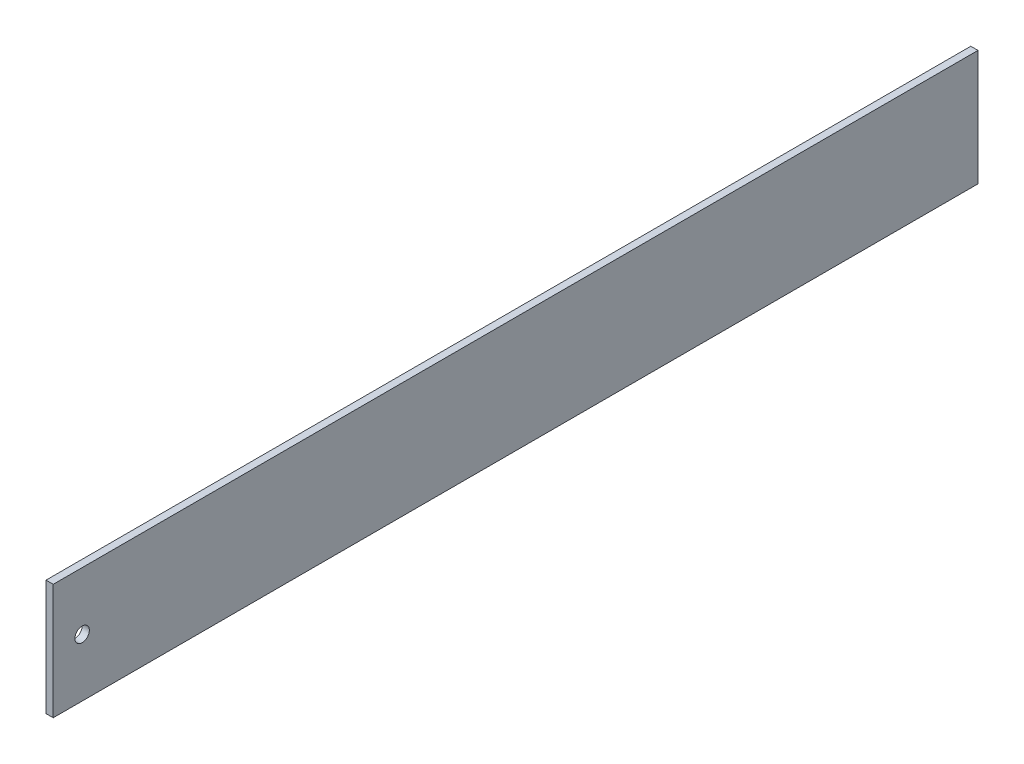
ISO-10303-21;
HEADER;
FILE_DESCRIPTION(('STEP AP214'),'2;1');
FILE_NAME('part.step','',(''),(''),'','','');
FILE_SCHEMA(('AUTOMOTIVE_DESIGN { 1 0 10303 214 1 1 1 1 }'));
ENDSEC;
DATA;
#1=APPLICATION_CONTEXT('core data for automotive mechanical design processes');
#2=APPLICATION_PROTOCOL_DEFINITION('international standard','automotive_design',2000,#1);
#3=PRODUCT_CONTEXT('',#1,'mechanical');
#4=PRODUCT('Part','Part','',(#3));
#5=PRODUCT_RELATED_PRODUCT_CATEGORY('part','',(#4));
#6=PRODUCT_DEFINITION_FORMATION('','',#4);
#7=PRODUCT_DEFINITION_CONTEXT('part definition',#1,'design');
#8=PRODUCT_DEFINITION('design','',#6,#7);
#9=PRODUCT_DEFINITION_SHAPE('','',#8);
#10=(LENGTH_UNIT() NAMED_UNIT(*) SI_UNIT(.MILLI.,.METRE.));
#11=(NAMED_UNIT(*) PLANE_ANGLE_UNIT() SI_UNIT($,.RADIAN.));
#12=(NAMED_UNIT(*) SI_UNIT($,.STERADIAN.) SOLID_ANGLE_UNIT());
#13=UNCERTAINTY_MEASURE_WITH_UNIT(LENGTH_MEASURE(1.E-05),#10,'distance_accuracy_value','');
#14=(GEOMETRIC_REPRESENTATION_CONTEXT(3) GLOBAL_UNCERTAINTY_ASSIGNED_CONTEXT((#13)) GLOBAL_UNIT_ASSIGNED_CONTEXT((#10,
#11,#12)) REPRESENTATION_CONTEXT('',''));
#15=CARTESIAN_POINT('',(0.,0.,0.));
#16=DIRECTION('',(0.,0.,1.));
#17=DIRECTION('',(1.,0.,0.));
#18=AXIS2_PLACEMENT_3D('',#15,#16,#17);
#19=CARTESIAN_POINT('',(3.175,25.4,-203.2));
#20=DIRECTION('',(0.,0.,1.));
#21=DIRECTION('',(1.,0.,0.));
#22=AXIS2_PLACEMENT_3D('',#19,#20,#21);
#23=PLANE('',#22);
#24=DIRECTION('',(0.,1.,0.));
#25=VECTOR('',#24,1.);
#26=CARTESIAN_POINT('',(0.,25.4,-203.2));
#27=LINE('',#26,#25);
#28=CARTESIAN_POINT('',(0.,-25.4,-203.2));
#29=VERTEX_POINT('',#28);
#30=CARTESIAN_POINT('',(0.,25.4,-203.2));
#31=VERTEX_POINT('',#30);
#32=EDGE_CURVE('E96',#29,#31,#27,.T.);
#33=ORIENTED_EDGE('',*,*,#32,.T.);
#34=DIRECTION('',(-1.,0.,0.));
#35=VECTOR('',#34,1.);
#36=CARTESIAN_POINT('',(3.175,25.4,-203.2));
#37=LINE('',#36,#35);
#38=CARTESIAN_POINT('',(3.175,25.4,-203.2));
#39=VERTEX_POINT('',#38);
#40=EDGE_CURVE('E11',#39,#31,#37,.T.);
#41=ORIENTED_EDGE('',*,*,#40,.F.);
#42=DIRECTION('',(0.,1.,0.));
#43=VECTOR('',#42,1.);
#44=CARTESIAN_POINT('',(3.175,25.4,-203.2));
#45=LINE('',#44,#43);
#46=CARTESIAN_POINT('',(3.175,-25.4,-203.2));
#47=VERTEX_POINT('',#46);
#48=EDGE_CURVE('E84',#47,#39,#45,.T.);
#49=ORIENTED_EDGE('',*,*,#48,.F.);
#50=DIRECTION('',(-1.,0.,0.));
#51=VECTOR('',#50,1.);
#52=CARTESIAN_POINT('',(3.175,-25.4,-203.2));
#53=LINE('',#52,#51);
#54=EDGE_CURVE('E92',#47,#29,#53,.T.);
#55=ORIENTED_EDGE('',*,*,#54,.T.);
#56=EDGE_LOOP('',(#33,#41,#49,#55));
#57=FACE_BOUND('',#56,.T.);
#58=ADVANCED_FACE('F33',(#57),#23,.F.);
#59=CARTESIAN_POINT('',(3.175,25.4,203.2));
#60=DIRECTION('',(0.,-1.,0.));
#61=DIRECTION('',(0.,0.,-1.));
#62=AXIS2_PLACEMENT_3D('',#59,#60,#61);
#63=PLANE('',#62);
#64=DIRECTION('',(0.,0.,1.));
#65=VECTOR('',#64,1.);
#66=CARTESIAN_POINT('',(0.,25.4,203.2));
#67=LINE('',#66,#65);
#68=CARTESIAN_POINT('',(0.,25.4,203.2));
#69=VERTEX_POINT('',#68);
#70=EDGE_CURVE('E88',#31,#69,#67,.T.);
#71=ORIENTED_EDGE('',*,*,#70,.T.);
#72=DIRECTION('',(-1.,0.,0.));
#73=VECTOR('',#72,1.);
#74=CARTESIAN_POINT('',(3.175,25.4,203.2));
#75=LINE('',#74,#73);
#76=CARTESIAN_POINT('',(3.175,25.4,203.2));
#77=VERTEX_POINT('',#76);
#78=EDGE_CURVE('E41',#77,#69,#75,.T.);
#79=ORIENTED_EDGE('',*,*,#78,.F.);
#80=DIRECTION('',(0.,0.,1.));
#81=VECTOR('',#80,1.);
#82=CARTESIAN_POINT('',(3.175,25.4,203.2));
#83=LINE('',#82,#81);
#84=EDGE_CURVE('E79',#39,#77,#83,.T.);
#85=ORIENTED_EDGE('',*,*,#84,.F.);
#86=ORIENTED_EDGE('',*,*,#40,.T.);
#87=EDGE_LOOP('',(#71,#79,#85,#86));
#88=FACE_BOUND('',#87,.T.);
#89=ADVANCED_FACE('F87',(#88),#63,.F.);
#90=CARTESIAN_POINT('',(3.175,25.4,203.2));
#91=DIRECTION('',(0.,0.,-1.));
#92=DIRECTION('',(-1.,0.,0.));
#93=AXIS2_PLACEMENT_3D('',#90,#91,#92);
#94=PLANE('',#93);
#95=DIRECTION('',(0.,-1.,0.));
#96=VECTOR('',#95,1.);
#97=CARTESIAN_POINT('',(0.,25.4,203.2));
#98=LINE('',#97,#96);
#99=CARTESIAN_POINT('',(0.,-25.4,203.2));
#100=VERTEX_POINT('',#99);
#101=EDGE_CURVE('E66',#69,#100,#98,.T.);
#102=ORIENTED_EDGE('',*,*,#101,.T.);
#103=DIRECTION('',(-1.,0.,0.));
#104=VECTOR('',#103,1.);
#105=CARTESIAN_POINT('',(3.175,-25.4,203.2));
#106=LINE('',#105,#104);
#107=CARTESIAN_POINT('',(3.175,-25.4,203.2));
#108=VERTEX_POINT('',#107);
#109=EDGE_CURVE('E89',#108,#100,#106,.T.);
#110=ORIENTED_EDGE('',*,*,#109,.F.);
#111=DIRECTION('',(0.,-1.,0.));
#112=VECTOR('',#111,1.);
#113=CARTESIAN_POINT('',(3.175,25.4,203.2));
#114=LINE('',#113,#112);
#115=EDGE_CURVE('E82',#77,#108,#114,.T.);
#116=ORIENTED_EDGE('',*,*,#115,.F.);
#117=ORIENTED_EDGE('',*,*,#78,.T.);
#118=EDGE_LOOP('',(#102,#110,#116,#117));
#119=FACE_BOUND('',#118,.T.);
#120=ADVANCED_FACE('F90',(#119),#94,.F.);
#121=CARTESIAN_POINT('',(3.175,-25.4,203.2));
#122=DIRECTION('',(0.,1.,0.));
#123=DIRECTION('',(0.,0.,1.));
#124=AXIS2_PLACEMENT_3D('',#121,#122,#123);
#125=PLANE('',#124);
#126=DIRECTION('',(0.,0.,-1.));
#127=VECTOR('',#126,1.);
#128=CARTESIAN_POINT('',(0.,-25.4,203.2));
#129=LINE('',#128,#127);
#130=EDGE_CURVE('E72',#100,#29,#129,.T.);
#131=ORIENTED_EDGE('',*,*,#130,.T.);
#132=ORIENTED_EDGE('',*,*,#54,.F.);
#133=DIRECTION('',(0.,0.,-1.));
#134=VECTOR('',#133,1.);
#135=CARTESIAN_POINT('',(3.175,-25.4,203.2));
#136=LINE('',#135,#134);
#137=EDGE_CURVE('E49',#108,#47,#136,.T.);
#138=ORIENTED_EDGE('',*,*,#137,.F.);
#139=ORIENTED_EDGE('',*,*,#109,.T.);
#140=EDGE_LOOP('',(#131,#132,#138,#139));
#141=FACE_BOUND('',#140,.T.);
#142=ADVANCED_FACE('F104',(#141),#125,.F.);
#143=CARTESIAN_POINT('',(3.175,0.,0.));
#144=DIRECTION('',(1.,0.,0.));
#145=DIRECTION('',(0.,0.,-1.));
#146=AXIS2_PLACEMENT_3D('',#143,#144,#145);
#147=PLANE('',#146);
#148=CARTESIAN_POINT('',(3.175,0.,190.5));
#149=DIRECTION('',(1.,0.,0.));
#150=DIRECTION('',(0.,0.,-1.));
#151=AXIS2_PLACEMENT_3D('',#148,#149,#150);
#152=CIRCLE('',#151,3.175);
#153=CARTESIAN_POINT('',(3.175,0.,187.325));
#154=VERTEX_POINT('',#153);
#155=EDGE_CURVE('E112',#154,#154,#152,.T.);
#156=ORIENTED_EDGE('',*,*,#155,.F.);
#157=EDGE_LOOP('',(#156));
#158=FACE_BOUND('',#157,.T.);
#159=ORIENTED_EDGE('',*,*,#48,.T.);
#160=ORIENTED_EDGE('',*,*,#84,.T.);
#161=ORIENTED_EDGE('',*,*,#115,.T.);
#162=ORIENTED_EDGE('',*,*,#137,.T.);
#163=EDGE_LOOP('',(#159,#160,#161,#162));
#164=FACE_BOUND('',#163,.T.);
#165=ADVANCED_FACE('F80',(#158,#164),#147,.T.);
#166=CARTESIAN_POINT('',(0.,0.,0.));
#167=DIRECTION('',(1.,0.,0.));
#168=DIRECTION('',(0.,0.,-1.));
#169=AXIS2_PLACEMENT_3D('',#166,#167,#168);
#170=PLANE('',#169);
#171=CARTESIAN_POINT('',(0.,0.,190.5));
#172=DIRECTION('',(1.,0.,0.));
#173=DIRECTION('',(0.,0.,-1.));
#174=AXIS2_PLACEMENT_3D('',#171,#172,#173);
#175=CIRCLE('',#174,3.175);
#176=CARTESIAN_POINT('',(0.,0.,187.325));
#177=VERTEX_POINT('',#176);
#178=EDGE_CURVE('E99',#177,#177,#175,.F.);
#179=ORIENTED_EDGE('',*,*,#178,.F.);
#180=EDGE_LOOP('',(#179));
#181=FACE_BOUND('',#180,.T.);
#182=ORIENTED_EDGE('',*,*,#32,.F.);
#183=ORIENTED_EDGE('',*,*,#130,.F.);
#184=ORIENTED_EDGE('',*,*,#101,.F.);
#185=ORIENTED_EDGE('',*,*,#70,.F.);
#186=EDGE_LOOP('',(#182,#183,#184,#185));
#187=FACE_BOUND('',#186,.T.);
#188=ADVANCED_FACE('F107',(#181,#187),#170,.F.);
#189=CARTESIAN_POINT('',(-0.00100000000000013,0.,190.5));
#190=DIRECTION('',(1.,0.,0.));
#191=DIRECTION('',(0.,0.,-1.));
#192=AXIS2_PLACEMENT_3D('',#189,#190,#191);
#193=CYLINDRICAL_SURFACE('',#192,3.175);
#194=ORIENTED_EDGE('',*,*,#155,.T.);
#195=EDGE_LOOP('',(#194));
#196=FACE_BOUND('',#195,.T.);
#197=ORIENTED_EDGE('',*,*,#178,.T.);
#198=EDGE_LOOP('',(#197));
#199=FACE_BOUND('',#198,.T.);
#200=ADVANCED_FACE('F116',(#196,#199),#193,.F.);
#201=CLOSED_SHELL('',(#58,#89,#120,#142,#165,#188,#200));
#202=MANIFOLD_SOLID_BREP('B2',#201);
#203=ADVANCED_BREP_SHAPE_REPRESENTATION('',(#18,#202),#14);
#204=SHAPE_DEFINITION_REPRESENTATION(#9,#203);
ENDSEC;
END-ISO-10303-21;
